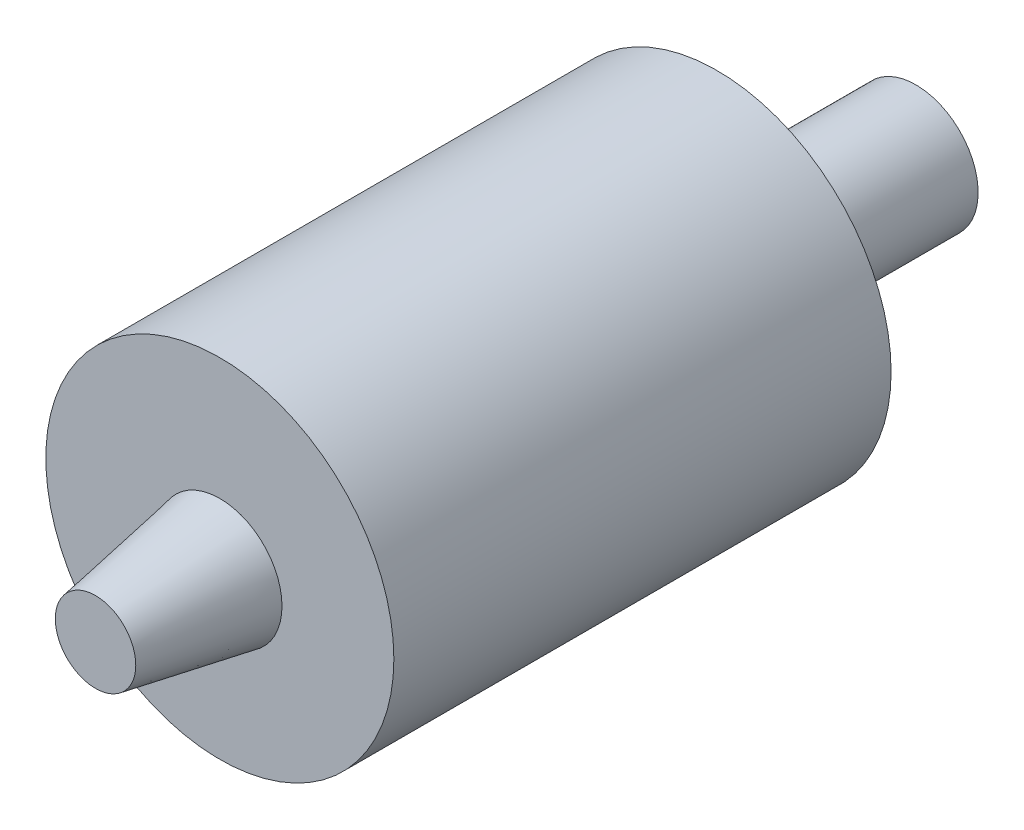
ISO-10303-21;
HEADER;
FILE_DESCRIPTION(('STEP AP214'),'2;1');
FILE_NAME('part.step','',(''),(''),'','','');
FILE_SCHEMA(('AUTOMOTIVE_DESIGN { 1 0 10303 214 1 1 1 1 }'));
ENDSEC;
DATA;
#1=APPLICATION_CONTEXT('core data for automotive mechanical design processes');
#2=APPLICATION_PROTOCOL_DEFINITION('international standard','automotive_design',2000,#1);
#3=PRODUCT_CONTEXT('',#1,'mechanical');
#4=PRODUCT('Part','Part','',(#3));
#5=PRODUCT_RELATED_PRODUCT_CATEGORY('part','',(#4));
#6=PRODUCT_DEFINITION_FORMATION('','',#4);
#7=PRODUCT_DEFINITION_CONTEXT('part definition',#1,'design');
#8=PRODUCT_DEFINITION('design','',#6,#7);
#9=PRODUCT_DEFINITION_SHAPE('','',#8);
#10=(LENGTH_UNIT() NAMED_UNIT(*) SI_UNIT(.MILLI.,.METRE.));
#11=(NAMED_UNIT(*) PLANE_ANGLE_UNIT() SI_UNIT($,.RADIAN.));
#12=(NAMED_UNIT(*) SI_UNIT($,.STERADIAN.) SOLID_ANGLE_UNIT());
#13=UNCERTAINTY_MEASURE_WITH_UNIT(LENGTH_MEASURE(1.E-05),#10,'distance_accuracy_value','');
#14=(GEOMETRIC_REPRESENTATION_CONTEXT(3) GLOBAL_UNCERTAINTY_ASSIGNED_CONTEXT((#13)) GLOBAL_UNIT_ASSIGNED_CONTEXT((#10,
#11,#12)) REPRESENTATION_CONTEXT('',''));
#15=CARTESIAN_POINT('',(0.,0.,0.));
#16=DIRECTION('',(0.,0.,1.));
#17=DIRECTION('',(1.,0.,0.));
#18=AXIS2_PLACEMENT_3D('',#15,#16,#17);
#19=CARTESIAN_POINT('',(0.,0.,40.));
#20=DIRECTION('',(0.,0.,-1.));
#21=DIRECTION('',(-1.,0.,0.));
#22=AXIS2_PLACEMENT_3D('',#19,#20,#21);
#23=CYLINDRICAL_SURFACE('',#22,14.);
#24=CARTESIAN_POINT('',(0.,0.,40.));
#25=DIRECTION('',(0.,0.,1.));
#26=DIRECTION('',(1.,0.,0.));
#27=AXIS2_PLACEMENT_3D('',#24,#25,#26);
#28=CIRCLE('',#27,14.);
#29=CARTESIAN_POINT('',(14.,0.,40.));
#30=VERTEX_POINT('',#29);
#31=EDGE_CURVE('E43',#30,#30,#28,.T.);
#32=ORIENTED_EDGE('',*,*,#31,.F.);
#33=EDGE_LOOP('',(#32));
#34=FACE_BOUND('',#33,.T.);
#35=CARTESIAN_POINT('',(0.,0.,0.));
#36=DIRECTION('',(0.,0.,1.));
#37=DIRECTION('',(1.,0.,0.));
#38=AXIS2_PLACEMENT_3D('',#35,#36,#37);
#39=CIRCLE('',#38,14.);
#40=CARTESIAN_POINT('',(14.,0.,0.));
#41=VERTEX_POINT('',#40);
#42=EDGE_CURVE('E34',#41,#41,#39,.T.);
#43=ORIENTED_EDGE('',*,*,#42,.T.);
#44=EDGE_LOOP('',(#43));
#45=FACE_BOUND('',#44,.T.);
#46=ADVANCED_FACE('F31',(#34,#45),#23,.T.);
#47=CARTESIAN_POINT('',(0.,0.,40.));
#48=DIRECTION('',(0.,0.,1.));
#49=DIRECTION('',(1.,0.,0.));
#50=AXIS2_PLACEMENT_3D('',#47,#48,#49);
#51=PLANE('',#50);
#52=CARTESIAN_POINT('',(0.,-0.817130219765218,40.));
#53=DIRECTION('',(0.,0.,1.));
#54=DIRECTION('',(1.,0.,0.));
#55=AXIS2_PLACEMENT_3D('',#52,#53,#54);
#56=CIRCLE('',#55,5.);
#57=CARTESIAN_POINT('',(5.,-0.817130219765218,40.));
#58=VERTEX_POINT('',#57);
#59=EDGE_CURVE('E10',#58,#58,#56,.T.);
#60=ORIENTED_EDGE('',*,*,#59,.F.);
#61=EDGE_LOOP('',(#60));
#62=FACE_BOUND('',#61,.T.);
#63=ORIENTED_EDGE('',*,*,#31,.T.);
#64=EDGE_LOOP('',(#63));
#65=FACE_BOUND('',#64,.T.);
#66=ADVANCED_FACE('F61',(#62,#65),#51,.T.);
#67=CARTESIAN_POINT('',(0.,0.,0.));
#68=DIRECTION('',(0.,0.,1.));
#69=DIRECTION('',(1.,0.,0.));
#70=AXIS2_PLACEMENT_3D('',#67,#68,#69);
#71=PLANE('',#70);
#72=CARTESIAN_POINT('',(0.,0.,0.));
#73=DIRECTION('',(0.,0.,-1.));
#74=DIRECTION('',(-1.,0.,0.));
#75=AXIS2_PLACEMENT_3D('',#72,#73,#74);
#76=CIRCLE('',#75,5.);
#77=CARTESIAN_POINT('',(-5.,0.,0.));
#78=VERTEX_POINT('',#77);
#79=EDGE_CURVE('E38',#78,#78,#76,.T.);
#80=ORIENTED_EDGE('',*,*,#79,.F.);
#81=EDGE_LOOP('',(#80));
#82=FACE_BOUND('',#81,.T.);
#83=ORIENTED_EDGE('',*,*,#42,.F.);
#84=EDGE_LOOP('',(#83));
#85=FACE_BOUND('',#84,.T.);
#86=ADVANCED_FACE('F58',(#82,#85),#71,.F.);
#87=CARTESIAN_POINT('',(0.,0.,-16.));
#88=DIRECTION('',(0.,0.,1.));
#89=DIRECTION('',(1.,0.,0.));
#90=AXIS2_PLACEMENT_3D('',#87,#88,#89);
#91=CYLINDRICAL_SURFACE('',#90,5.);
#92=CARTESIAN_POINT('',(0.,0.,-16.));
#93=DIRECTION('',(0.,0.,-1.));
#94=DIRECTION('',(-1.,0.,0.));
#95=AXIS2_PLACEMENT_3D('',#92,#93,#94);
#96=CIRCLE('',#95,5.);
#97=CARTESIAN_POINT('',(-5.,0.,-16.));
#98=VERTEX_POINT('',#97);
#99=EDGE_CURVE('E49',#98,#98,#96,.T.);
#100=ORIENTED_EDGE('',*,*,#99,.F.);
#101=EDGE_LOOP('',(#100));
#102=FACE_BOUND('',#101,.T.);
#103=ORIENTED_EDGE('',*,*,#79,.T.);
#104=EDGE_LOOP('',(#103));
#105=FACE_BOUND('',#104,.T.);
#106=ADVANCED_FACE('F60',(#102,#105),#91,.T.);
#107=CARTESIAN_POINT('',(0.,0.,-16.));
#108=DIRECTION('',(0.,0.,-1.));
#109=DIRECTION('',(-1.,0.,0.));
#110=AXIS2_PLACEMENT_3D('',#107,#108,#109);
#111=PLANE('',#110);
#112=ORIENTED_EDGE('',*,*,#99,.T.);
#113=EDGE_LOOP('',(#112));
#114=FACE_BOUND('',#113,.T.);
#115=ADVANCED_FACE('F67',(#114),#111,.T.);
#116=CARTESIAN_POINT('',(0.,-0.817130219765218,40.));
#117=DIRECTION('',(0.,0.,-1.));
#118=DIRECTION('',(1.,0.,0.));
#119=AXIS2_PLACEMENT_3D('',#116,#117,#118);
#120=CONICAL_SURFACE('',#119,5.,0.174532925199433);
#121=CARTESIAN_POINT('',(0.,-0.817130219765218,50.));
#122=DIRECTION('',(0.,0.,1.));
#123=DIRECTION('',(1.,0.,0.));
#124=AXIS2_PLACEMENT_3D('',#121,#122,#123);
#125=CIRCLE('',#124,3.23673019291535);
#126=CARTESIAN_POINT('',(3.23673019291535,-0.817130219765218,50.));
#127=VERTEX_POINT('',#126);
#128=EDGE_CURVE('E46',#127,#127,#125,.T.);
#129=ORIENTED_EDGE('',*,*,#128,.F.);
#130=EDGE_LOOP('',(#129));
#131=FACE_BOUND('',#130,.T.);
#132=ORIENTED_EDGE('',*,*,#59,.T.);
#133=EDGE_LOOP('',(#132));
#134=FACE_BOUND('',#133,.T.);
#135=ADVANCED_FACE('F92',(#131,#134),#120,.T.);
#136=CARTESIAN_POINT('',(0.,-0.817130219765218,50.));
#137=DIRECTION('',(0.,0.,1.));
#138=DIRECTION('',(1.,0.,0.));
#139=AXIS2_PLACEMENT_3D('',#136,#137,#138);
#140=PLANE('',#139);
#141=ORIENTED_EDGE('',*,*,#128,.T.);
#142=EDGE_LOOP('',(#141));
#143=FACE_BOUND('',#142,.T.);
#144=ADVANCED_FACE('F97',(#143),#140,.T.);
#145=CLOSED_SHELL('',(#46,#66,#86,#106,#115,#135,#144));
#146=MANIFOLD_SOLID_BREP('B2',#145);
#147=ADVANCED_BREP_SHAPE_REPRESENTATION('',(#18,#146),#14);
#148=SHAPE_DEFINITION_REPRESENTATION(#9,#147);
ENDSEC;
END-ISO-10303-21;
